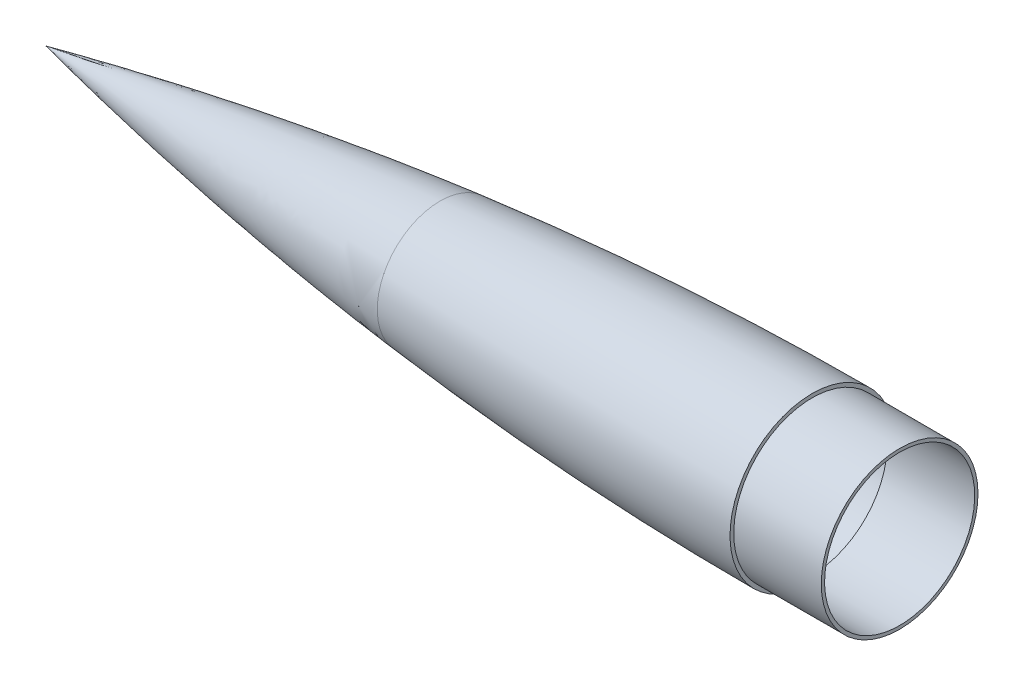
ISO-10303-21;
HEADER;
FILE_DESCRIPTION(('STEP AP214'),'2;1');
FILE_NAME('part.step','',(''),(''),'','','');
FILE_SCHEMA(('AUTOMOTIVE_DESIGN { 1 0 10303 214 1 1 1 1 }'));
ENDSEC;
DATA;
#1=APPLICATION_CONTEXT('core data for automotive mechanical design processes');
#2=APPLICATION_PROTOCOL_DEFINITION('international standard','automotive_design',2000,#1);
#3=PRODUCT_CONTEXT('',#1,'mechanical');
#4=PRODUCT('Part','Part','',(#3));
#5=PRODUCT_RELATED_PRODUCT_CATEGORY('part','',(#4));
#6=PRODUCT_DEFINITION_FORMATION('','',#4);
#7=PRODUCT_DEFINITION_CONTEXT('part definition',#1,'design');
#8=PRODUCT_DEFINITION('design','',#6,#7);
#9=PRODUCT_DEFINITION_SHAPE('','',#8);
#10=(LENGTH_UNIT() NAMED_UNIT(*) SI_UNIT(.MILLI.,.METRE.));
#11=(NAMED_UNIT(*) PLANE_ANGLE_UNIT() SI_UNIT($,.RADIAN.));
#12=(NAMED_UNIT(*) SI_UNIT($,.STERADIAN.) SOLID_ANGLE_UNIT());
#13=UNCERTAINTY_MEASURE_WITH_UNIT(LENGTH_MEASURE(1.E-05),#10,'distance_accuracy_value','');
#14=(GEOMETRIC_REPRESENTATION_CONTEXT(3) GLOBAL_UNCERTAINTY_ASSIGNED_CONTEXT((#13)) GLOBAL_UNIT_ASSIGNED_CONTEXT((#10,
#11,#12)) REPRESENTATION_CONTEXT('',''));
#15=CARTESIAN_POINT('',(0.,0.,0.));
#16=DIRECTION('',(0.,0.,1.));
#17=DIRECTION('',(1.,0.,0.));
#18=AXIS2_PLACEMENT_3D('',#15,#16,#17);
#19=CARTESIAN_POINT('',(179.,0.,0.));
#20=DIRECTION('',(1.,0.,0.));
#21=DIRECTION('',(0.,0.,-1.));
#22=AXIS2_PLACEMENT_3D('',#19,#20,#21);
#23=CYLINDRICAL_SURFACE('',#22,26.1395359321817);
#24=CARTESIAN_POINT('',(179.,0.,0.));
#25=DIRECTION('',(1.,0.,0.));
#26=DIRECTION('',(0.,0.,-1.));
#27=AXIS2_PLACEMENT_3D('',#24,#25,#26);
#28=CIRCLE('',#27,26.1395359321817);
#29=CARTESIAN_POINT('',(179.,0.,-26.1395359321817));
#30=VERTEX_POINT('',#29);
#31=EDGE_CURVE('E11',#30,#30,#28,.T.);
#32=ORIENTED_EDGE('',*,*,#31,.T.);
#33=EDGE_LOOP('',(#32));
#34=FACE_BOUND('',#33,.T.);
#35=CARTESIAN_POINT('',(190.,0.,0.));
#36=DIRECTION('',(1.,0.,0.));
#37=DIRECTION('',(0.,0.,-1.));
#38=AXIS2_PLACEMENT_3D('',#35,#36,#37);
#39=CIRCLE('',#38,26.1395359321817);
#40=CARTESIAN_POINT('',(190.,0.,-26.1395359321817));
#41=VERTEX_POINT('',#40);
#42=EDGE_CURVE('E58',#41,#41,#39,.T.);
#43=ORIENTED_EDGE('',*,*,#42,.F.);
#44=EDGE_LOOP('',(#43));
#45=FACE_BOUND('',#44,.T.);
#46=ADVANCED_FACE('F48',(#34,#45),#23,.T.);
#47=CARTESIAN_POINT('',(179.,0.,0.));
#48=DIRECTION('',(1.,0.,0.));
#49=DIRECTION('',(0.,0.,-1.));
#50=AXIS2_PLACEMENT_3D('',#47,#48,#49);
#51=PLANE('',#50);
#52=CARTESIAN_POINT('',(179.,0.,0.));
#53=DIRECTION('',(1.,0.,0.));
#54=DIRECTION('',(0.,0.,-1.));
#55=AXIS2_PLACEMENT_3D('',#52,#53,#54);
#56=CIRCLE('',#55,25.14);
#57=CARTESIAN_POINT('',(179.,0.,-25.14));
#58=VERTEX_POINT('',#57);
#59=EDGE_CURVE('E54',#58,#58,#56,.T.);
#60=ORIENTED_EDGE('',*,*,#59,.T.);
#61=EDGE_LOOP('',(#60));
#62=FACE_BOUND('',#61,.T.);
#63=ORIENTED_EDGE('',*,*,#31,.F.);
#64=EDGE_LOOP('',(#63));
#65=FACE_BOUND('',#64,.T.);
#66=ADVANCED_FACE('F77',(#62,#65),#51,.F.);
#67=CARTESIAN_POINT('',(179.,0.,0.));
#68=DIRECTION('',(1.,0.,0.));
#69=DIRECTION('',(0.,0.,-1.));
#70=AXIS2_PLACEMENT_3D('',#67,#68,#69);
#71=CYLINDRICAL_SURFACE('',#70,25.14);
#72=ORIENTED_EDGE('',*,*,#59,.F.);
#73=EDGE_LOOP('',(#72));
#74=FACE_BOUND('',#73,.T.);
#75=CARTESIAN_POINT('',(190.,0.,0.));
#76=DIRECTION('',(1.,0.,0.));
#77=DIRECTION('',(0.,0.,-1.));
#78=AXIS2_PLACEMENT_3D('',#75,#76,#77);
#79=CIRCLE('',#78,25.14);
#80=CARTESIAN_POINT('',(190.,0.,-25.14));
#81=VERTEX_POINT('',#80);
#82=EDGE_CURVE('E62',#81,#81,#79,.T.);
#83=ORIENTED_EDGE('',*,*,#82,.T.);
#84=EDGE_LOOP('',(#83));
#85=FACE_BOUND('',#84,.T.);
#86=ADVANCED_FACE('F68',(#74,#85),#71,.F.);
#87=CARTESIAN_POINT('',(190.,0.,0.));
#88=DIRECTION('',(1.,0.,0.));
#89=DIRECTION('',(0.,0.,-1.));
#90=AXIS2_PLACEMENT_3D('',#87,#88,#89);
#91=PLANE('',#90);
#92=ORIENTED_EDGE('',*,*,#42,.T.);
#93=EDGE_LOOP('',(#92));
#94=FACE_BOUND('',#93,.T.);
#95=ORIENTED_EDGE('',*,*,#82,.F.);
#96=EDGE_LOOP('',(#95));
#97=FACE_BOUND('',#96,.T.);
#98=ADVANCED_FACE('F70',(#94,#97),#91,.T.);
#99=CLOSED_SHELL('',(#46,#66,#86,#98));
#100=MANIFOLD_SOLID_BREP('B2',#99);
#101=CARTESIAN_POINT('',(180.,0.,0.));
#102=DIRECTION('',(1.,0.,0.));
#103=DIRECTION('',(0.,0.,-1.));
#104=AXIS2_PLACEMENT_3D('',#101,#102,#103);
#105=PLANE('',#104);
#106=CARTESIAN_POINT('',(180.,0.,0.));
#107=DIRECTION('',(1.,0.,0.));
#108=DIRECTION('',(0.,1.,0.));
#109=AXIS2_PLACEMENT_3D('',#106,#107,#108);
#110=CIRCLE('',#109,28.6530612244898);
#111=CARTESIAN_POINT('',(180.,28.6530612244898,0.));
#112=VERTEX_POINT('',#111);
#113=EDGE_CURVE('E128',#112,#112,#110,.T.);
#114=ORIENTED_EDGE('',*,*,#113,.T.);
#115=EDGE_LOOP('',(#114));
#116=FACE_BOUND('',#115,.T.);
#117=CARTESIAN_POINT('',(180.,0.,0.));
#118=DIRECTION('',(1.,0.,0.));
#119=DIRECTION('',(0.,1.,0.));
#120=AXIS2_PLACEMENT_3D('',#117,#118,#119);
#121=CIRCLE('',#120,26.1395359321817);
#122=CARTESIAN_POINT('',(180.,26.1395359321817,0.));
#123=VERTEX_POINT('',#122);
#124=EDGE_CURVE('E46',#123,#123,#121,.T.);
#125=ORIENTED_EDGE('',*,*,#124,.F.);
#126=EDGE_LOOP('',(#125));
#127=FACE_BOUND('',#126,.T.);
#128=ADVANCED_FACE('F117',(#116,#127),#105,.T.);
#129=CARTESIAN_POINT('',(11.6168650450072,2.44801652388707,0.));
#130=CARTESIAN_POINT('',(180.808432524549,37.5000000004238,0.));
#131=CARTESIAN_POINT('',(350.000000004092,37.5,0.));
#132=B_SPLINE_CURVE_WITH_KNOTS('',2,(#129,#130,#131),.UNSPECIFIED.,.F.,.F.,(3,3),
(0.109802513175564,0.916555116933789),.UNSPECIFIED.);
#133=CARTESIAN_POINT('',(350.000000004102,0.,0.));
#134=DIRECTION('',(1.,0.,0.));
#135=AXIS1_PLACEMENT('',#133,#134);
#136=SURFACE_OF_REVOLUTION('',#132,#135);
#137=OFFSET_SURFACE('',#136,-2.5,.F.);
#138=CARTESIAN_POINT('',(12.1240288240528,0.,0.));
#139=VERTEX_POINT('',#138);
#140=VERTEX_LOOP('',#139);
#141=FACE_BOUND('',#140,.T.);
#142=ORIENTED_EDGE('',*,*,#124,.T.);
#143=EDGE_LOOP('',(#142));
#144=FACE_BOUND('',#143,.T.);
#145=ADVANCED_FACE('F138',(#141,#144),#137,.F.);
#146=CARTESIAN_POINT('',(-6.65722685311287E-09,-1.42654985046953E-09,0.));
#147=CARTESIAN_POINT('',(174.999999998717,37.5000000004384,0.));
#148=CARTESIAN_POINT('',(350.000000004092,37.5,0.));
#149=B_SPLINE_CURVE_WITH_KNOTS('',2,(#146,#147,#148),.UNSPECIFIED.,.F.,.F.,(3,3),
(0.0821062861485544,0.916555116933789),.UNSPECIFIED.);
#150=CARTESIAN_POINT('',(350.000000004102,0.,0.));
#151=DIRECTION('',(1.,0.,0.));
#152=AXIS1_PLACEMENT('',#150,#151);
#153=SURFACE_OF_REVOLUTION('',#149,#152);
#154=CARTESIAN_POINT('',(-5.51546655569446E-09,0.,0.));
#155=VERTEX_POINT('',#154);
#156=VERTEX_LOOP('',#155);
#157=FACE_BOUND('',#156,.T.);
#158=ORIENTED_EDGE('',*,*,#113,.F.);
#159=EDGE_LOOP('',(#158));
#160=FACE_BOUND('',#159,.T.);
#161=ADVANCED_FACE('F135',(#157,#160),#153,.T.);
#162=CLOSED_SHELL('',(#128,#145,#161));
#163=MANIFOLD_SOLID_BREP('B6',#162);
#164=CARTESIAN_POINT('',(180.,0.,0.));
#165=DIRECTION('',(1.,0.,0.));
#166=DIRECTION('',(0.,0.,-1.));
#167=AXIS2_PLACEMENT_3D('',#164,#165,#166);
#168=PLANE('',#167);
#169=CARTESIAN_POINT('',(180.,0.,0.));
#170=DIRECTION('',(1.,0.,0.));
#171=DIRECTION('',(0.,1.,0.));
#172=AXIS2_PLACEMENT_3D('',#169,#170,#171);
#173=CIRCLE('',#172,26.1395359321817);
#174=CARTESIAN_POINT('',(180.,26.1395359321817,0.));
#175=VERTEX_POINT('',#174);
#176=EDGE_CURVE('E116',#175,#175,#173,.T.);
#177=ORIENTED_EDGE('',*,*,#176,.T.);
#178=EDGE_LOOP('',(#177));
#179=FACE_BOUND('',#178,.T.);
#180=CARTESIAN_POINT('',(180.,0.,0.));
#181=DIRECTION('',(1.,0.,0.));
#182=DIRECTION('',(0.,1.,0.));
#183=AXIS2_PLACEMENT_3D('',#180,#181,#182);
#184=CIRCLE('',#183,28.6530612244898);
#185=CARTESIAN_POINT('',(180.,28.6530612244898,0.));
#186=VERTEX_POINT('',#185);
#187=EDGE_CURVE('E183',#186,#186,#184,.T.);
#188=ORIENTED_EDGE('',*,*,#187,.F.);
#189=EDGE_LOOP('',(#188));
#190=FACE_BOUND('',#189,.T.);
#191=ADVANCED_FACE('F180',(#179,#190),#168,.F.);
#192=CARTESIAN_POINT('',(390.000000004097,0.,0.));
#193=DIRECTION('',(1.,0.,0.));
#194=DIRECTION('',(0.,1.,0.));
#195=AXIS2_PLACEMENT_3D('',#192,#193,#194);
#196=PLANE('',#195);
#197=CARTESIAN_POINT('',(390.000000004097,0.,0.));
#198=DIRECTION('',(1.,0.,0.));
#199=DIRECTION('',(0.,1.,0.));
#200=AXIS2_PLACEMENT_3D('',#197,#198,#199);
#201=CIRCLE('',#200,35.8);
#202=CARTESIAN_POINT('',(390.000000004097,35.8,0.));
#203=VERTEX_POINT('',#202);
#204=EDGE_CURVE('E259',#203,#203,#201,.T.);
#205=ORIENTED_EDGE('',*,*,#204,.T.);
#206=EDGE_LOOP('',(#205));
#207=FACE_BOUND('',#206,.T.);
#208=CARTESIAN_POINT('',(390.000000004097,0.,0.));
#209=DIRECTION('',(1.,0.,0.));
#210=DIRECTION('',(0.,1.,0.));
#211=AXIS2_PLACEMENT_3D('',#208,#209,#210);
#212=CIRCLE('',#211,34.3);
#213=CARTESIAN_POINT('',(390.000000004097,34.3,0.));
#214=VERTEX_POINT('',#213);
#215=EDGE_CURVE('E260',#214,#214,#212,.T.);
#216=ORIENTED_EDGE('',*,*,#215,.F.);
#217=EDGE_LOOP('',(#216));
#218=FACE_BOUND('',#217,.T.);
#219=ADVANCED_FACE('F229',(#207,#218),#196,.T.);
#220=CARTESIAN_POINT('',(390.000000004097,0.,0.));
#221=DIRECTION('',(-1.,0.,0.));
#222=DIRECTION('',(0.,-1.,0.));
#223=AXIS2_PLACEMENT_3D('',#220,#221,#222);
#224=CYLINDRICAL_SURFACE('',#223,34.3);
#225=ORIENTED_EDGE('',*,*,#215,.T.);
#226=EDGE_LOOP('',(#225));
#227=FACE_BOUND('',#226,.T.);
#228=CARTESIAN_POINT('',(350.000000004097,0.,0.));
#229=DIRECTION('',(1.,0.,0.));
#230=DIRECTION('',(0.,1.,0.));
#231=AXIS2_PLACEMENT_3D('',#228,#229,#230);
#232=CIRCLE('',#231,34.3);
#233=CARTESIAN_POINT('',(350.000000004097,34.3,0.));
#234=VERTEX_POINT('',#233);
#235=EDGE_CURVE('E263',#234,#234,#232,.T.);
#236=ORIENTED_EDGE('',*,*,#235,.F.);
#237=EDGE_LOOP('',(#236));
#238=FACE_BOUND('',#237,.T.);
#239=ADVANCED_FACE('F233',(#227,#238),#224,.F.);
#240=CARTESIAN_POINT('',(350.000000004097,0.,0.));
#241=DIRECTION('',(1.,0.,0.));
#242=DIRECTION('',(0.,1.,0.));
#243=AXIS2_PLACEMENT_3D('',#240,#241,#242);
#244=PLANE('',#243);
#245=ORIENTED_EDGE('',*,*,#235,.T.);
#246=EDGE_LOOP('',(#245));
#247=FACE_BOUND('',#246,.T.);
#248=CARTESIAN_POINT('',(350.000000004085,0.,0.));
#249=DIRECTION('',(1.,0.,0.));
#250=DIRECTION('',(0.,1.,0.));
#251=AXIS2_PLACEMENT_3D('',#248,#249,#250);
#252=CIRCLE('',#251,35.);
#253=CARTESIAN_POINT('',(350.000000004085,35.,0.));
#254=VERTEX_POINT('',#253);
#255=EDGE_CURVE('E197',#254,#254,#252,.T.);
#256=ORIENTED_EDGE('',*,*,#255,.F.);
#257=EDGE_LOOP('',(#256));
#258=FACE_BOUND('',#257,.T.);
#259=ADVANCED_FACE('F243',(#247,#258),#244,.F.);
#260=CARTESIAN_POINT('',(11.6168650450072,2.44801652388707,0.));
#261=CARTESIAN_POINT('',(180.808432524549,37.5000000004238,0.));
#262=CARTESIAN_POINT('',(350.000000004092,37.5,0.));
#263=B_SPLINE_CURVE_WITH_KNOTS('',2,(#260,#261,#262),.UNSPECIFIED.,.F.,.F.,(3,3),
(0.109802513175564,0.916555116933789),.UNSPECIFIED.);
#264=CARTESIAN_POINT('',(350.000000004102,0.,0.));
#265=DIRECTION('',(1.,0.,0.));
#266=AXIS1_PLACEMENT('',#264,#265);
#267=SURFACE_OF_REVOLUTION('',#263,#266);
#268=OFFSET_SURFACE('',#267,-2.5,.F.);
#269=ORIENTED_EDGE('',*,*,#176,.F.);
#270=EDGE_LOOP('',(#269));
#271=FACE_BOUND('',#270,.T.);
#272=ORIENTED_EDGE('',*,*,#255,.T.);
#273=EDGE_LOOP('',(#272));
#274=FACE_BOUND('',#273,.T.);
#275=ADVANCED_FACE('F223',(#271,#274),#268,.F.);
#276=CARTESIAN_POINT('',(390.000000004097,0.,0.));
#277=DIRECTION('',(-1.,0.,0.));
#278=DIRECTION('',(0.,-1.,0.));
#279=AXIS2_PLACEMENT_3D('',#276,#277,#278);
#280=CYLINDRICAL_SURFACE('',#279,35.8);
#281=ORIENTED_EDGE('',*,*,#204,.F.);
#282=EDGE_LOOP('',(#281));
#283=FACE_BOUND('',#282,.T.);
#284=CARTESIAN_POINT('',(350.000000004097,0.,0.));
#285=DIRECTION('',(-1.,0.,0.));
#286=DIRECTION('',(0.,-1.,0.));
#287=AXIS2_PLACEMENT_3D('',#284,#285,#286);
#288=CIRCLE('',#287,35.8);
#289=CARTESIAN_POINT('',(350.000000004097,-35.8,0.));
#290=VERTEX_POINT('',#289);
#291=EDGE_CURVE('E190',#290,#290,#288,.F.);
#292=ORIENTED_EDGE('',*,*,#291,.T.);
#293=EDGE_LOOP('',(#292));
#294=FACE_BOUND('',#293,.T.);
#295=ADVANCED_FACE('F218',(#283,#294),#280,.T.);
#296=CARTESIAN_POINT('',(350.000000004097,37.5000000020758,0.));
#297=DIRECTION('',(-1.,0.,0.));
#298=DIRECTION('',(0.,-1.,0.));
#299=AXIS2_PLACEMENT_3D('',#296,#297,#298);
#300=PLANE('',#299);
#301=ORIENTED_EDGE('',*,*,#291,.F.);
#302=EDGE_LOOP('',(#301));
#303=FACE_BOUND('',#302,.T.);
#304=CARTESIAN_POINT('',(350.000000004092,0.,0.));
#305=DIRECTION('',(1.,0.,0.));
#306=DIRECTION('',(0.,1.,0.));
#307=AXIS2_PLACEMENT_3D('',#304,#305,#306);
#308=CIRCLE('',#307,37.5);
#309=CARTESIAN_POINT('',(350.000000004092,37.5,0.));
#310=VERTEX_POINT('',#309);
#311=EDGE_CURVE('E194',#310,#310,#308,.T.);
#312=ORIENTED_EDGE('',*,*,#311,.T.);
#313=EDGE_LOOP('',(#312));
#314=FACE_BOUND('',#313,.T.);
#315=ADVANCED_FACE('F213',(#303,#314),#300,.F.);
#316=CARTESIAN_POINT('',(-6.65722685311287E-09,-1.42654985046953E-09,0.));
#317=CARTESIAN_POINT('',(174.999999998717,37.5000000004384,0.));
#318=CARTESIAN_POINT('',(350.000000004092,37.5,0.));
#319=B_SPLINE_CURVE_WITH_KNOTS('',2,(#316,#317,#318),.UNSPECIFIED.,.F.,.F.,(3,3),
(0.0821062861485544,0.916555116933789),.UNSPECIFIED.);
#320=CARTESIAN_POINT('',(350.000000004102,0.,0.));
#321=DIRECTION('',(1.,0.,0.));
#322=AXIS1_PLACEMENT('',#320,#321);
#323=SURFACE_OF_REVOLUTION('',#319,#322);
#324=ORIENTED_EDGE('',*,*,#187,.T.);
#325=EDGE_LOOP('',(#324));
#326=FACE_BOUND('',#325,.T.);
#327=ORIENTED_EDGE('',*,*,#311,.F.);
#328=EDGE_LOOP('',(#327));
#329=FACE_BOUND('',#328,.T.);
#330=ADVANCED_FACE('F210',(#326,#329),#323,.T.);
#331=CLOSED_SHELL('',(#191,#219,#239,#259,#275,#295,#315,#330));
#332=MANIFOLD_SOLID_BREP('B40',#331);
#333=ADVANCED_BREP_SHAPE_REPRESENTATION('',(#18,#100,#163,#332),#14);
#334=SHAPE_DEFINITION_REPRESENTATION(#9,#333);
ENDSEC;
END-ISO-10303-21;
